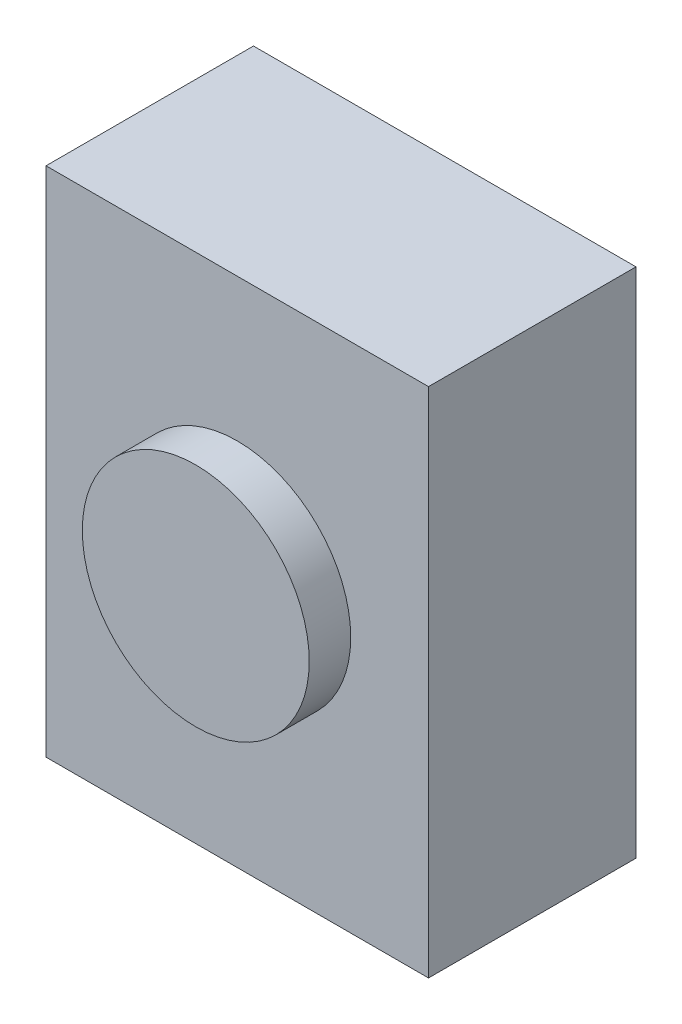
ISO-10303-21;
HEADER;
FILE_DESCRIPTION(('STEP AP214'),'2;1');
FILE_NAME('part.step','',(''),(''),'','','');
FILE_SCHEMA(('AUTOMOTIVE_DESIGN { 1 0 10303 214 1 1 1 1 }'));
ENDSEC;
DATA;
#1=APPLICATION_CONTEXT('core data for automotive mechanical design processes');
#2=APPLICATION_PROTOCOL_DEFINITION('international standard','automotive_design',2000,#1);
#3=PRODUCT_CONTEXT('',#1,'mechanical');
#4=PRODUCT('Part','Part','',(#3));
#5=PRODUCT_RELATED_PRODUCT_CATEGORY('part','',(#4));
#6=PRODUCT_DEFINITION_FORMATION('','',#4);
#7=PRODUCT_DEFINITION_CONTEXT('part definition',#1,'design');
#8=PRODUCT_DEFINITION('design','',#6,#7);
#9=PRODUCT_DEFINITION_SHAPE('','',#8);
#10=(LENGTH_UNIT() NAMED_UNIT(*) SI_UNIT(.MILLI.,.METRE.));
#11=(NAMED_UNIT(*) PLANE_ANGLE_UNIT() SI_UNIT($,.RADIAN.));
#12=(NAMED_UNIT(*) SI_UNIT($,.STERADIAN.) SOLID_ANGLE_UNIT());
#13=UNCERTAINTY_MEASURE_WITH_UNIT(LENGTH_MEASURE(1.E-05),#10,'distance_accuracy_value','');
#14=(GEOMETRIC_REPRESENTATION_CONTEXT(3) GLOBAL_UNCERTAINTY_ASSIGNED_CONTEXT((#13)) GLOBAL_UNIT_ASSIGNED_CONTEXT((#10,
#11,#12)) REPRESENTATION_CONTEXT('',''));
#15=CARTESIAN_POINT('',(0.,0.,0.));
#16=DIRECTION('',(0.,0.,1.));
#17=DIRECTION('',(1.,0.,0.));
#18=AXIS2_PLACEMENT_3D('',#15,#16,#17);
#19=CARTESIAN_POINT('',(1.475,-1.975,1.6));
#20=DIRECTION('',(-1.,0.,0.));
#21=DIRECTION('',(0.,0.,1.));
#22=AXIS2_PLACEMENT_3D('',#19,#20,#21);
#23=PLANE('',#22);
#24=DIRECTION('',(0.,1.,0.));
#25=VECTOR('',#24,1.);
#26=CARTESIAN_POINT('',(1.475,-1.975,0.));
#27=LINE('',#26,#25);
#28=CARTESIAN_POINT('',(1.475,-1.975,0.));
#29=VERTEX_POINT('',#28);
#30=CARTESIAN_POINT('',(1.475,1.975,0.));
#31=VERTEX_POINT('',#30);
#32=EDGE_CURVE('E99',#29,#31,#27,.T.);
#33=ORIENTED_EDGE('',*,*,#32,.T.);
#34=DIRECTION('',(0.,0.,-1.));
#35=VECTOR('',#34,1.);
#36=CARTESIAN_POINT('',(1.475,1.975,1.6));
#37=LINE('',#36,#35);
#38=CARTESIAN_POINT('',(1.475,1.975,1.6));
#39=VERTEX_POINT('',#38);
#40=EDGE_CURVE('E41',#39,#31,#37,.T.);
#41=ORIENTED_EDGE('',*,*,#40,.F.);
#42=DIRECTION('',(0.,1.,0.));
#43=VECTOR('',#42,1.);
#44=CARTESIAN_POINT('',(1.475,-1.975,1.6));
#45=LINE('',#44,#43);
#46=CARTESIAN_POINT('',(1.475,-1.975,1.6));
#47=VERTEX_POINT('',#46);
#48=EDGE_CURVE('E85',#47,#39,#45,.T.);
#49=ORIENTED_EDGE('',*,*,#48,.F.);
#50=DIRECTION('',(0.,0.,-1.));
#51=VECTOR('',#50,1.);
#52=CARTESIAN_POINT('',(1.475,-1.975,1.6));
#53=LINE('',#52,#51);
#54=EDGE_CURVE('E95',#47,#29,#53,.T.);
#55=ORIENTED_EDGE('',*,*,#54,.T.);
#56=EDGE_LOOP('',(#33,#41,#49,#55));
#57=FACE_BOUND('',#56,.T.);
#58=ADVANCED_FACE('F33',(#57),#23,.F.);
#59=CARTESIAN_POINT('',(-1.475,1.975,1.6));
#60=DIRECTION('',(0.,-1.,0.));
#61=DIRECTION('',(0.,0.,-1.));
#62=AXIS2_PLACEMENT_3D('',#59,#60,#61);
#63=PLANE('',#62);
#64=DIRECTION('',(-1.,0.,0.));
#65=VECTOR('',#64,1.);
#66=CARTESIAN_POINT('',(-1.475,1.975,0.));
#67=LINE('',#66,#65);
#68=CARTESIAN_POINT('',(-1.475,1.975,0.));
#69=VERTEX_POINT('',#68);
#70=EDGE_CURVE('E90',#31,#69,#67,.T.);
#71=ORIENTED_EDGE('',*,*,#70,.T.);
#72=DIRECTION('',(0.,0.,-1.));
#73=VECTOR('',#72,1.);
#74=CARTESIAN_POINT('',(-1.475,1.975,1.6));
#75=LINE('',#74,#73);
#76=CARTESIAN_POINT('',(-1.475,1.975,1.6));
#77=VERTEX_POINT('',#76);
#78=EDGE_CURVE('E88',#77,#69,#75,.T.);
#79=ORIENTED_EDGE('',*,*,#78,.F.);
#80=DIRECTION('',(-1.,0.,0.));
#81=VECTOR('',#80,1.);
#82=CARTESIAN_POINT('',(-1.475,1.975,1.6));
#83=LINE('',#82,#81);
#84=EDGE_CURVE('E80',#39,#77,#83,.T.);
#85=ORIENTED_EDGE('',*,*,#84,.F.);
#86=ORIENTED_EDGE('',*,*,#40,.T.);
#87=EDGE_LOOP('',(#71,#79,#85,#86));
#88=FACE_BOUND('',#87,.T.);
#89=ADVANCED_FACE('F89',(#88),#63,.F.);
#90=CARTESIAN_POINT('',(-1.475,-1.975,1.6));
#91=DIRECTION('',(1.,0.,0.));
#92=DIRECTION('',(0.,0.,-1.));
#93=AXIS2_PLACEMENT_3D('',#90,#91,#92);
#94=PLANE('',#93);
#95=DIRECTION('',(0.,-1.,0.));
#96=VECTOR('',#95,1.);
#97=CARTESIAN_POINT('',(-1.475,-1.975,0.));
#98=LINE('',#97,#96);
#99=CARTESIAN_POINT('',(-1.475,-1.975,0.));
#100=VERTEX_POINT('',#99);
#101=EDGE_CURVE('E66',#69,#100,#98,.T.);
#102=ORIENTED_EDGE('',*,*,#101,.T.);
#103=DIRECTION('',(0.,0.,-1.));
#104=VECTOR('',#103,1.);
#105=CARTESIAN_POINT('',(-1.475,-1.975,1.6));
#106=LINE('',#105,#104);
#107=CARTESIAN_POINT('',(-1.475,-1.975,1.6));
#108=VERTEX_POINT('',#107);
#109=EDGE_CURVE('E91',#108,#100,#106,.T.);
#110=ORIENTED_EDGE('',*,*,#109,.F.);
#111=DIRECTION('',(0.,-1.,0.));
#112=VECTOR('',#111,1.);
#113=CARTESIAN_POINT('',(-1.475,-1.975,1.6));
#114=LINE('',#113,#112);
#115=EDGE_CURVE('E83',#77,#108,#114,.T.);
#116=ORIENTED_EDGE('',*,*,#115,.F.);
#117=ORIENTED_EDGE('',*,*,#78,.T.);
#118=EDGE_LOOP('',(#102,#110,#116,#117));
#119=FACE_BOUND('',#118,.T.);
#120=ADVANCED_FACE('F93',(#119),#94,.F.);
#121=CARTESIAN_POINT('',(-1.475,-1.975,1.6));
#122=DIRECTION('',(0.,1.,0.));
#123=DIRECTION('',(0.,0.,1.));
#124=AXIS2_PLACEMENT_3D('',#121,#122,#123);
#125=PLANE('',#124);
#126=DIRECTION('',(1.,0.,0.));
#127=VECTOR('',#126,1.);
#128=CARTESIAN_POINT('',(-1.475,-1.975,0.));
#129=LINE('',#128,#127);
#130=EDGE_CURVE('E72',#100,#29,#129,.T.);
#131=ORIENTED_EDGE('',*,*,#130,.T.);
#132=ORIENTED_EDGE('',*,*,#54,.F.);
#133=DIRECTION('',(1.,0.,0.));
#134=VECTOR('',#133,1.);
#135=CARTESIAN_POINT('',(-1.475,-1.975,1.6));
#136=LINE('',#135,#134);
#137=EDGE_CURVE('E49',#108,#47,#136,.T.);
#138=ORIENTED_EDGE('',*,*,#137,.F.);
#139=ORIENTED_EDGE('',*,*,#109,.T.);
#140=EDGE_LOOP('',(#131,#132,#138,#139));
#141=FACE_BOUND('',#140,.T.);
#142=ADVANCED_FACE('F121',(#141),#125,.F.);
#143=CARTESIAN_POINT('',(0.,0.,1.6));
#144=DIRECTION('',(0.,0.,-1.));
#145=DIRECTION('',(-1.,0.,0.));
#146=AXIS2_PLACEMENT_3D('',#143,#144,#145);
#147=PLANE('',#146);
#148=CARTESIAN_POINT('',(0.,0.,1.6));
#149=DIRECTION('',(0.,0.,-1.));
#150=DIRECTION('',(-1.,0.,0.));
#151=AXIS2_PLACEMENT_3D('',#148,#149,#150);
#152=CIRCLE('',#151,0.875);
#153=CARTESIAN_POINT('',(-0.875,0.,1.6));
#154=VERTEX_POINT('',#153);
#155=EDGE_CURVE('E11',#154,#154,#152,.F.);
#156=ORIENTED_EDGE('',*,*,#155,.F.);
#157=EDGE_LOOP('',(#156));
#158=FACE_BOUND('',#157,.T.);
#159=ORIENTED_EDGE('',*,*,#48,.T.);
#160=ORIENTED_EDGE('',*,*,#84,.T.);
#161=ORIENTED_EDGE('',*,*,#115,.T.);
#162=ORIENTED_EDGE('',*,*,#137,.T.);
#163=EDGE_LOOP('',(#159,#160,#161,#162));
#164=FACE_BOUND('',#163,.T.);
#165=ADVANCED_FACE('F81',(#158,#164),#147,.F.);
#166=CARTESIAN_POINT('',(0.,0.,0.));
#167=DIRECTION('',(0.,0.,-1.));
#168=DIRECTION('',(-1.,0.,0.));
#169=AXIS2_PLACEMENT_3D('',#166,#167,#168);
#170=PLANE('',#169);
#171=ORIENTED_EDGE('',*,*,#32,.F.);
#172=ORIENTED_EDGE('',*,*,#130,.F.);
#173=ORIENTED_EDGE('',*,*,#101,.F.);
#174=ORIENTED_EDGE('',*,*,#70,.F.);
#175=EDGE_LOOP('',(#171,#172,#173,#174));
#176=FACE_BOUND('',#175,.T.);
#177=ADVANCED_FACE('F110',(#176),#170,.T.);
#178=CARTESIAN_POINT('',(0.,0.,1.92));
#179=DIRECTION('',(0.,0.,-1.));
#180=DIRECTION('',(-1.,0.,0.));
#181=AXIS2_PLACEMENT_3D('',#178,#179,#180);
#182=CYLINDRICAL_SURFACE('',#181,0.875);
#183=CARTESIAN_POINT('',(0.,0.,1.92));
#184=DIRECTION('',(0.,0.,1.));
#185=DIRECTION('',(1.,0.,0.));
#186=AXIS2_PLACEMENT_3D('',#183,#184,#185);
#187=CIRCLE('',#186,0.875);
#188=CARTESIAN_POINT('',(-0.875,0.,1.92));
#189=VERTEX_POINT('',#188);
#190=EDGE_CURVE('E102',#189,#189,#187,.T.);
#191=CARTESIAN_POINT('',(-0.875,0.,1.92));
#192=CARTESIAN_POINT('',(-0.875,0.,1.91666666666667));
#193=CARTESIAN_POINT('',(-0.875,0.,1.91333333333333));
#194=CARTESIAN_POINT('',(-0.875,0.,1.90666666666667));
#195=CARTESIAN_POINT('',(-0.875,0.,1.90333333333333));
#196=CARTESIAN_POINT('',(-0.875,0.,1.89666666666667));
#197=CARTESIAN_POINT('',(-0.875,0.,1.89333333333333));
#198=CARTESIAN_POINT('',(-0.875,0.,1.88666666666667));
#199=CARTESIAN_POINT('',(-0.875,0.,1.88333333333333));
#200=CARTESIAN_POINT('',(-0.875,0.,1.87666666666667));
#201=CARTESIAN_POINT('',(-0.875,0.,1.87333333333333));
#202=CARTESIAN_POINT('',(-0.875,0.,1.86666666666667));
#203=CARTESIAN_POINT('',(-0.875,0.,1.86333333333333));
#204=CARTESIAN_POINT('',(-0.875,0.,1.85666666666667));
#205=CARTESIAN_POINT('',(-0.875,0.,1.85333333333333));
#206=CARTESIAN_POINT('',(-0.875,0.,1.84666666666667));
#207=CARTESIAN_POINT('',(-0.875,0.,1.84333333333333));
#208=CARTESIAN_POINT('',(-0.875,0.,1.83666666666667));
#209=CARTESIAN_POINT('',(-0.875,0.,1.83333333333333));
#210=CARTESIAN_POINT('',(-0.875,0.,1.82666666666667));
#211=CARTESIAN_POINT('',(-0.875,0.,1.82333333333333));
#212=CARTESIAN_POINT('',(-0.875,0.,1.81666666666667));
#213=CARTESIAN_POINT('',(-0.875,0.,1.81333333333333));
#214=CARTESIAN_POINT('',(-0.875,0.,1.80666666666667));
#215=CARTESIAN_POINT('',(-0.875,0.,1.80333333333333));
#216=CARTESIAN_POINT('',(-0.875,0.,1.79666666666667));
#217=CARTESIAN_POINT('',(-0.875,0.,1.79333333333333));
#218=CARTESIAN_POINT('',(-0.875,0.,1.78666666666667));
#219=CARTESIAN_POINT('',(-0.875,0.,1.78333333333333));
#220=CARTESIAN_POINT('',(-0.875,0.,1.77666666666667));
#221=CARTESIAN_POINT('',(-0.875,0.,1.77333333333333));
#222=CARTESIAN_POINT('',(-0.875,0.,1.76666666666667));
#223=CARTESIAN_POINT('',(-0.875,0.,1.76333333333333));
#224=CARTESIAN_POINT('',(-0.875,0.,1.75666666666667));
#225=CARTESIAN_POINT('',(-0.875,0.,1.75333333333333));
#226=CARTESIAN_POINT('',(-0.875,0.,1.74666666666667));
#227=CARTESIAN_POINT('',(-0.875,0.,1.74333333333333));
#228=CARTESIAN_POINT('',(-0.875,0.,1.73666666666667));
#229=CARTESIAN_POINT('',(-0.875,0.,1.73333333333333));
#230=CARTESIAN_POINT('',(-0.875,0.,1.72666666666667));
#231=CARTESIAN_POINT('',(-0.875,0.,1.72333333333333));
#232=CARTESIAN_POINT('',(-0.875,0.,1.71666666666667));
#233=CARTESIAN_POINT('',(-0.875,0.,1.71333333333333));
#234=CARTESIAN_POINT('',(-0.875,0.,1.70666666666667));
#235=CARTESIAN_POINT('',(-0.875,0.,1.70333333333333));
#236=CARTESIAN_POINT('',(-0.875,0.,1.69666666666667));
#237=CARTESIAN_POINT('',(-0.875,0.,1.69333333333333));
#238=CARTESIAN_POINT('',(-0.875,0.,1.68666666666667));
#239=CARTESIAN_POINT('',(-0.875,0.,1.68333333333333));
#240=CARTESIAN_POINT('',(-0.875,0.,1.67666666666667));
#241=CARTESIAN_POINT('',(-0.875,0.,1.67333333333333));
#242=CARTESIAN_POINT('',(-0.875,0.,1.66666666666667));
#243=CARTESIAN_POINT('',(-0.875,0.,1.66333333333333));
#244=CARTESIAN_POINT('',(-0.875,0.,1.65666666666667));
#245=CARTESIAN_POINT('',(-0.875,0.,1.65333333333333));
#246=CARTESIAN_POINT('',(-0.875,0.,1.64666666666667));
#247=CARTESIAN_POINT('',(-0.875,0.,1.64333333333333));
#248=CARTESIAN_POINT('',(-0.875,0.,1.63666666666667));
#249=CARTESIAN_POINT('',(-0.875,0.,1.63333333333333));
#250=CARTESIAN_POINT('',(-0.875,0.,1.62666666666667));
#251=CARTESIAN_POINT('',(-0.875,0.,1.62333333333333));
#252=CARTESIAN_POINT('',(-0.875,0.,1.61666666666667));
#253=CARTESIAN_POINT('',(-0.875,0.,1.61333333333333));
#254=CARTESIAN_POINT('',(-0.875,0.,1.60666666666667));
#255=CARTESIAN_POINT('',(-0.875,0.,1.60333333333333));
#256=CARTESIAN_POINT('',(-0.875,0.,1.6));
#257=B_SPLINE_CURVE_WITH_KNOTS('',3,(#191,#192,#193,#194,#195,#196,#197,#198,#199,#200,#201,
#202,#203,#204,#205,#206,#207,#208,#209,#210,#211,#212,#213,#214,#215,#216,#217,#218,#219,#220,
#221,#222,#223,#224,#225,#226,#227,#228,#229,#230,#231,#232,#233,#234,#235,#236,#237,#238,#239,
#240,#241,#242,#243,#244,#245,#246,#247,#248,#249,#250,#251,#252,#253,#254,#255,#256),
.UNSPECIFIED.,.F.,.F.,(4,2,2,2,2,2,2,2,2,2,2,2,2,2,2,2,2,2,2,2,2,2,2,2,2,2,2,2,2,2,2,2,4),(0.,
0.01,0.0200000000000001,0.0300000000000001,0.0400000000000001,0.0500000000000001,
0.0600000000000002,0.07,0.08,0.09,0.1,0.11,0.12,0.13,0.14,0.15,0.16,0.17,0.18,0.19,0.2,0.21,
0.22,0.23,0.24,0.25,0.26,0.27,0.28,0.29,0.3,0.31,0.32),.UNSPECIFIED.);
#258=EDGE_CURVE('BSEAM112',#189,#154,#257,.T.);
#259=ORIENTED_EDGE('',*,*,#190,.F.);
#260=ORIENTED_EDGE('',*,*,#155,.T.);
#261=ORIENTED_EDGE('',*,*,#258,.T.);
#262=ORIENTED_EDGE('',*,*,#258,.F.);
#263=EDGE_LOOP('',(#259,#261,#260,#262));
#264=FACE_BOUND('',#263,.T.);
#265=ADVANCED_FACE('F112',(#264),#182,.T.);
#266=CARTESIAN_POINT('',(0.,0.,1.92));
#267=DIRECTION('',(0.,0.,1.));
#268=DIRECTION('',(1.,0.,0.));
#269=AXIS2_PLACEMENT_3D('',#266,#267,#268);
#270=PLANE('',#269);
#271=ORIENTED_EDGE('',*,*,#190,.T.);
#272=EDGE_LOOP('',(#271));
#273=FACE_BOUND('',#272,.T.);
#274=ADVANCED_FACE('F118',(#273),#270,.T.);
#275=CLOSED_SHELL('',(#58,#89,#120,#142,#165,#177,#265,#274));
#276=MANIFOLD_SOLID_BREP('B2',#275);
#277=ADVANCED_BREP_SHAPE_REPRESENTATION('',(#18,#276),#14);
#278=SHAPE_DEFINITION_REPRESENTATION(#9,#277);
ENDSEC;
END-ISO-10303-21;
